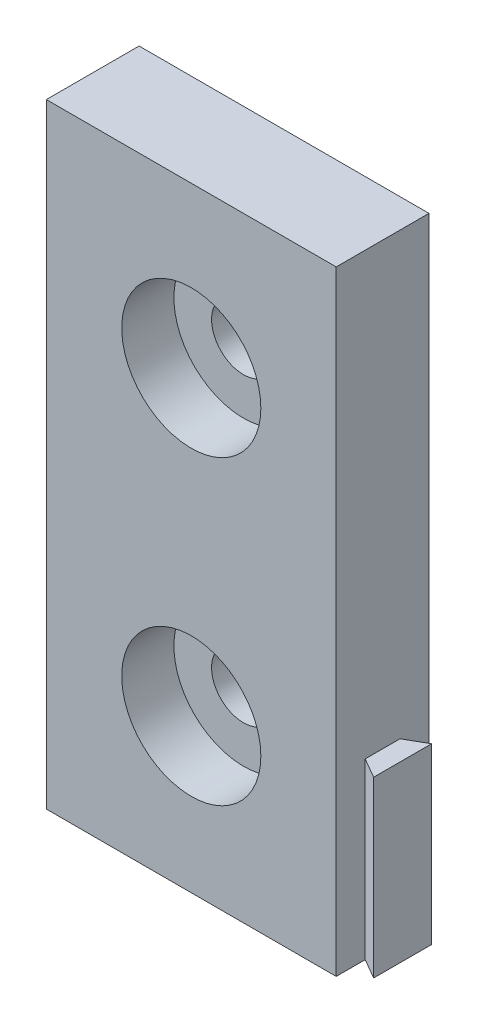
ISO-10303-21;
HEADER;
FILE_DESCRIPTION(('STEP AP214'),'2;1');
FILE_NAME('part.step','',(''),(''),'','','');
FILE_SCHEMA(('AUTOMOTIVE_DESIGN { 1 0 10303 214 1 1 1 1 }'));
ENDSEC;
DATA;
#1=APPLICATION_CONTEXT('core data for automotive mechanical design processes');
#2=APPLICATION_PROTOCOL_DEFINITION('international standard','automotive_design',2000,#1);
#3=PRODUCT_CONTEXT('',#1,'mechanical');
#4=PRODUCT('Part','Part','',(#3));
#5=PRODUCT_RELATED_PRODUCT_CATEGORY('part','',(#4));
#6=PRODUCT_DEFINITION_FORMATION('','',#4);
#7=PRODUCT_DEFINITION_CONTEXT('part definition',#1,'design');
#8=PRODUCT_DEFINITION('design','',#6,#7);
#9=PRODUCT_DEFINITION_SHAPE('','',#8);
#10=(LENGTH_UNIT() NAMED_UNIT(*) SI_UNIT(.MILLI.,.METRE.));
#11=(NAMED_UNIT(*) PLANE_ANGLE_UNIT() SI_UNIT($,.RADIAN.));
#12=(NAMED_UNIT(*) SI_UNIT($,.STERADIAN.) SOLID_ANGLE_UNIT());
#13=UNCERTAINTY_MEASURE_WITH_UNIT(LENGTH_MEASURE(1.E-05),#10,'distance_accuracy_value','');
#14=(GEOMETRIC_REPRESENTATION_CONTEXT(3) GLOBAL_UNCERTAINTY_ASSIGNED_CONTEXT((#13)) GLOBAL_UNIT_ASSIGNED_CONTEXT((#10,
#11,#12)) REPRESENTATION_CONTEXT('',''));
#15=CARTESIAN_POINT('',(0.,0.,0.));
#16=DIRECTION('',(0.,0.,1.));
#17=DIRECTION('',(1.,0.,0.));
#18=AXIS2_PLACEMENT_3D('',#15,#16,#17);
#19=CARTESIAN_POINT('',(12.5,39.2,8.));
#20=DIRECTION('',(0.,0.,-1.));
#21=DIRECTION('',(-1.,0.,0.));
#22=AXIS2_PLACEMENT_3D('',#19,#20,#21);
#23=CYLINDRICAL_SURFACE('',#22,2.75);
#24=CARTESIAN_POINT('',(12.5,39.2,0.));
#25=DIRECTION('',(0.,0.,1.));
#26=DIRECTION('',(1.,0.,0.));
#27=AXIS2_PLACEMENT_3D('',#24,#25,#26);
#28=CIRCLE('',#27,2.75);
#29=CARTESIAN_POINT('',(15.25,39.2,0.));
#30=VERTEX_POINT('',#29);
#31=EDGE_CURVE('E172',#30,#30,#28,.T.);
#32=ORIENTED_EDGE('',*,*,#31,.F.);
#33=EDGE_LOOP('',(#32));
#34=FACE_BOUND('',#33,.T.);
#35=CARTESIAN_POINT('',(12.5,39.2,3.5));
#36=DIRECTION('',(0.,0.,1.));
#37=DIRECTION('',(1.,0.,0.));
#38=AXIS2_PLACEMENT_3D('',#35,#36,#37);
#39=CIRCLE('',#38,2.75);
#40=CARTESIAN_POINT('',(15.25,39.2,3.5));
#41=VERTEX_POINT('',#40);
#42=EDGE_CURVE('E45',#41,#41,#39,.T.);
#43=ORIENTED_EDGE('',*,*,#42,.T.);
#44=EDGE_LOOP('',(#43));
#45=FACE_BOUND('',#44,.T.);
#46=ADVANCED_FACE('F41',(#34,#45),#23,.F.);
#47=CARTESIAN_POINT('',(12.5,13.2,8.));
#48=DIRECTION('',(0.,0.,-1.));
#49=DIRECTION('',(-1.,0.,0.));
#50=AXIS2_PLACEMENT_3D('',#47,#48,#49);
#51=CYLINDRICAL_SURFACE('',#50,2.75);
#52=CARTESIAN_POINT('',(12.5,13.2,0.));
#53=DIRECTION('',(0.,0.,1.));
#54=DIRECTION('',(1.,0.,0.));
#55=AXIS2_PLACEMENT_3D('',#52,#53,#54);
#56=CIRCLE('',#55,2.75);
#57=CARTESIAN_POINT('',(15.25,13.2,0.));
#58=VERTEX_POINT('',#57);
#59=EDGE_CURVE('E163',#58,#58,#56,.T.);
#60=ORIENTED_EDGE('',*,*,#59,.F.);
#61=EDGE_LOOP('',(#60));
#62=FACE_BOUND('',#61,.T.);
#63=CARTESIAN_POINT('',(12.5,13.2,3.5));
#64=DIRECTION('',(0.,0.,1.));
#65=DIRECTION('',(1.,0.,0.));
#66=AXIS2_PLACEMENT_3D('',#63,#64,#65);
#67=CIRCLE('',#66,2.75);
#68=CARTESIAN_POINT('',(15.25,13.2,3.5));
#69=VERTEX_POINT('',#68);
#70=EDGE_CURVE('E207',#69,#69,#67,.T.);
#71=ORIENTED_EDGE('',*,*,#70,.T.);
#72=EDGE_LOOP('',(#71));
#73=FACE_BOUND('',#72,.T.);
#74=ADVANCED_FACE('F264',(#62,#73),#51,.F.);
#75=CARTESIAN_POINT('',(25.,0.,8.));
#76=DIRECTION('',(-1.,0.,0.));
#77=DIRECTION('',(0.,-1.,0.));
#78=AXIS2_PLACEMENT_3D('',#75,#76,#77);
#79=PLANE('',#78);
#80=DIRECTION('',(0.,-1.,0.));
#81=VECTOR('',#80,1.);
#82=CARTESIAN_POINT('',(25.,15.,5.5));
#83=LINE('',#82,#81);
#84=CARTESIAN_POINT('',(25.,15.,5.5));
#85=VERTEX_POINT('',#84);
#86=CARTESIAN_POINT('',(25.,0.,5.5));
#87=VERTEX_POINT('',#86);
#88=EDGE_CURVE('E140',#85,#87,#83,.T.);
#89=ORIENTED_EDGE('',*,*,#88,.F.);
#90=DIRECTION('',(0.,0.,-1.));
#91=VECTOR('',#90,1.);
#92=CARTESIAN_POINT('',(25.,15.,2.5));
#93=LINE('',#92,#91);
#94=CARTESIAN_POINT('',(25.,15.,2.5));
#95=VERTEX_POINT('',#94);
#96=EDGE_CURVE('E131',#85,#95,#93,.T.);
#97=ORIENTED_EDGE('',*,*,#96,.T.);
#98=DIRECTION('',(0.,-1.,0.));
#99=VECTOR('',#98,1.);
#100=CARTESIAN_POINT('',(25.,15.,2.5));
#101=LINE('',#100,#99);
#102=CARTESIAN_POINT('',(25.,0.,2.5));
#103=VERTEX_POINT('',#102);
#104=EDGE_CURVE('E116',#95,#103,#101,.T.);
#105=ORIENTED_EDGE('',*,*,#104,.T.);
#106=DIRECTION('',(0.,0.,-1.));
#107=VECTOR('',#106,1.);
#108=CARTESIAN_POINT('',(25.,0.,8.));
#109=LINE('',#108,#107);
#110=CARTESIAN_POINT('',(25.,0.,0.));
#111=VERTEX_POINT('',#110);
#112=EDGE_CURVE('E205',#103,#111,#109,.T.);
#113=ORIENTED_EDGE('',*,*,#112,.T.);
#114=DIRECTION('',(0.,1.,0.));
#115=VECTOR('',#114,1.);
#116=CARTESIAN_POINT('',(25.,0.,0.));
#117=LINE('',#116,#115);
#118=CARTESIAN_POINT('',(25.,53.,0.));
#119=VERTEX_POINT('',#118);
#120=EDGE_CURVE('E195',#111,#119,#117,.T.);
#121=ORIENTED_EDGE('',*,*,#120,.T.);
#122=DIRECTION('',(0.,0.,-1.));
#123=VECTOR('',#122,1.);
#124=CARTESIAN_POINT('',(25.,53.,8.));
#125=LINE('',#124,#123);
#126=CARTESIAN_POINT('',(25.,53.,8.));
#127=VERTEX_POINT('',#126);
#128=EDGE_CURVE('E202',#127,#119,#125,.T.);
#129=ORIENTED_EDGE('',*,*,#128,.F.);
#130=DIRECTION('',(0.,1.,0.));
#131=VECTOR('',#130,1.);
#132=CARTESIAN_POINT('',(25.,0.,8.));
#133=LINE('',#132,#131);
#134=CARTESIAN_POINT('',(25.,0.,8.));
#135=VERTEX_POINT('',#134);
#136=EDGE_CURVE('E182',#135,#127,#133,.T.);
#137=ORIENTED_EDGE('',*,*,#136,.F.);
#138=EDGE_CURVE('E51',#135,#87,#109,.T.);
#139=ORIENTED_EDGE('',*,*,#138,.T.);
#140=EDGE_LOOP('',(#89,#97,#105,#113,#121,#129,#137,#139));
#141=FACE_BOUND('',#140,.T.);
#142=ADVANCED_FACE('F138',(#141),#79,.F.);
#143=CARTESIAN_POINT('',(0.,0.,8.));
#144=DIRECTION('',(0.,0.,-1.));
#145=DIRECTION('',(-1.,0.,0.));
#146=AXIS2_PLACEMENT_3D('',#143,#144,#145);
#147=PLANE('',#146);
#148=CARTESIAN_POINT('',(12.5,39.2,8.));
#149=DIRECTION('',(0.,0.,1.));
#150=DIRECTION('',(1.,0.,0.));
#151=AXIS2_PLACEMENT_3D('',#148,#149,#150);
#152=CIRCLE('',#151,6.);
#153=CARTESIAN_POINT('',(18.5,39.2,8.));
#154=VERTEX_POINT('',#153);
#155=EDGE_CURVE('E217',#154,#154,#152,.T.);
#156=ORIENTED_EDGE('',*,*,#155,.F.);
#157=EDGE_LOOP('',(#156));
#158=FACE_BOUND('',#157,.T.);
#159=CARTESIAN_POINT('',(12.5,13.2,8.));
#160=DIRECTION('',(0.,0.,1.));
#161=DIRECTION('',(1.,0.,0.));
#162=AXIS2_PLACEMENT_3D('',#159,#160,#161);
#163=CIRCLE('',#162,6.);
#164=CARTESIAN_POINT('',(18.5,13.2,8.));
#165=VERTEX_POINT('',#164);
#166=EDGE_CURVE('E149',#165,#165,#163,.T.);
#167=ORIENTED_EDGE('',*,*,#166,.F.);
#168=EDGE_LOOP('',(#167));
#169=FACE_BOUND('',#168,.T.);
#170=DIRECTION('',(0.,-1.,0.));
#171=VECTOR('',#170,1.);
#172=CARTESIAN_POINT('',(0.,0.,8.));
#173=LINE('',#172,#171);
#174=CARTESIAN_POINT('',(0.,53.,8.));
#175=VERTEX_POINT('',#174);
#176=CARTESIAN_POINT('',(0.,0.,8.));
#177=VERTEX_POINT('',#176);
#178=EDGE_CURVE('E177',#175,#177,#173,.T.);
#179=ORIENTED_EDGE('',*,*,#178,.T.);
#180=DIRECTION('',(1.,0.,0.));
#181=VECTOR('',#180,1.);
#182=CARTESIAN_POINT('',(0.,0.,8.));
#183=LINE('',#182,#181);
#184=EDGE_CURVE('E96',#177,#135,#183,.T.);
#185=ORIENTED_EDGE('',*,*,#184,.T.);
#186=ORIENTED_EDGE('',*,*,#136,.T.);
#187=DIRECTION('',(-1.,0.,0.));
#188=VECTOR('',#187,1.);
#189=CARTESIAN_POINT('',(0.,53.,8.));
#190=LINE('',#189,#188);
#191=EDGE_CURVE('E68',#127,#175,#190,.T.);
#192=ORIENTED_EDGE('',*,*,#191,.T.);
#193=EDGE_LOOP('',(#179,#185,#186,#192));
#194=FACE_BOUND('',#193,.T.);
#195=ADVANCED_FACE('F235',(#158,#169,#194),#147,.F.);
#196=CARTESIAN_POINT('',(0.,0.,0.));
#197=DIRECTION('',(0.,0.,-1.));
#198=DIRECTION('',(-1.,0.,0.));
#199=AXIS2_PLACEMENT_3D('',#196,#197,#198);
#200=PLANE('',#199);
#201=ORIENTED_EDGE('',*,*,#31,.T.);
#202=EDGE_LOOP('',(#201));
#203=FACE_BOUND('',#202,.T.);
#204=DIRECTION('',(0.,-1.,0.));
#205=VECTOR('',#204,1.);
#206=CARTESIAN_POINT('',(0.,0.,0.));
#207=LINE('',#206,#205);
#208=CARTESIAN_POINT('',(0.,53.,0.));
#209=VERTEX_POINT('',#208);
#210=CARTESIAN_POINT('',(0.,0.,0.));
#211=VERTEX_POINT('',#210);
#212=EDGE_CURVE('E176',#209,#211,#207,.T.);
#213=ORIENTED_EDGE('',*,*,#212,.F.);
#214=DIRECTION('',(-1.,0.,0.));
#215=VECTOR('',#214,1.);
#216=CARTESIAN_POINT('',(0.,53.,0.));
#217=LINE('',#216,#215);
#218=EDGE_CURVE('E89',#119,#209,#217,.T.);
#219=ORIENTED_EDGE('',*,*,#218,.F.);
#220=ORIENTED_EDGE('',*,*,#120,.F.);
#221=DIRECTION('',(1.,0.,0.));
#222=VECTOR('',#221,1.);
#223=CARTESIAN_POINT('',(0.,0.,0.));
#224=LINE('',#223,#222);
#225=EDGE_CURVE('E191',#211,#111,#224,.T.);
#226=ORIENTED_EDGE('',*,*,#225,.F.);
#227=EDGE_LOOP('',(#213,#219,#220,#226));
#228=FACE_BOUND('',#227,.T.);
#229=ORIENTED_EDGE('',*,*,#59,.T.);
#230=EDGE_LOOP('',(#229));
#231=FACE_BOUND('',#230,.T.);
#232=ADVANCED_FACE('F237',(#203,#228,#231),#200,.T.);
#233=CARTESIAN_POINT('',(0.,0.,8.));
#234=DIRECTION('',(1.,0.,0.));
#235=DIRECTION('',(0.,1.,0.));
#236=AXIS2_PLACEMENT_3D('',#233,#234,#235);
#237=PLANE('',#236);
#238=ORIENTED_EDGE('',*,*,#212,.T.);
#239=DIRECTION('',(0.,0.,-1.));
#240=VECTOR('',#239,1.);
#241=CARTESIAN_POINT('',(0.,0.,8.));
#242=LINE('',#241,#240);
#243=EDGE_CURVE('E11',#177,#211,#242,.T.);
#244=ORIENTED_EDGE('',*,*,#243,.F.);
#245=ORIENTED_EDGE('',*,*,#178,.F.);
#246=DIRECTION('',(0.,0.,-1.));
#247=VECTOR('',#246,1.);
#248=CARTESIAN_POINT('',(0.,53.,8.));
#249=LINE('',#248,#247);
#250=EDGE_CURVE('E187',#175,#209,#249,.T.);
#251=ORIENTED_EDGE('',*,*,#250,.T.);
#252=EDGE_LOOP('',(#238,#244,#245,#251));
#253=FACE_BOUND('',#252,.T.);
#254=ADVANCED_FACE('F43',(#253),#237,.F.);
#255=CARTESIAN_POINT('',(0.,0.,8.));
#256=DIRECTION('',(0.,1.,0.));
#257=DIRECTION('',(0.,0.,1.));
#258=AXIS2_PLACEMENT_3D('',#255,#256,#257);
#259=PLANE('',#258);
#260=ORIENTED_EDGE('',*,*,#225,.T.);
#261=ORIENTED_EDGE('',*,*,#112,.F.);
#262=DIRECTION('',(0.86602540378444,0.,-0.499999999999998));
#263=VECTOR('',#262,1.);
#264=CARTESIAN_POINT('',(25.,0.,2.5));
#265=LINE('',#264,#263);
#266=CARTESIAN_POINT('',(26.7320508075689,0.,1.5));
#267=VERTEX_POINT('',#266);
#268=EDGE_CURVE('E59',#103,#267,#265,.T.);
#269=ORIENTED_EDGE('',*,*,#268,.T.);
#270=DIRECTION('',(0.,0.,1.));
#271=VECTOR('',#270,1.);
#272=CARTESIAN_POINT('',(26.7320508075689,0.,1.5));
#273=LINE('',#272,#271);
#274=CARTESIAN_POINT('',(26.7320508075689,0.,6.5));
#275=VERTEX_POINT('',#274);
#276=EDGE_CURVE('E146',#267,#275,#273,.T.);
#277=ORIENTED_EDGE('',*,*,#276,.T.);
#278=DIRECTION('',(-0.866025403784439,0.,-0.499999999999998));
#279=VECTOR('',#278,1.);
#280=CARTESIAN_POINT('',(26.7320508075689,0.,6.5));
#281=LINE('',#280,#279);
#282=EDGE_CURVE('E142',#275,#87,#281,.T.);
#283=ORIENTED_EDGE('',*,*,#282,.T.);
#284=ORIENTED_EDGE('',*,*,#138,.F.);
#285=ORIENTED_EDGE('',*,*,#184,.F.);
#286=ORIENTED_EDGE('',*,*,#243,.T.);
#287=EDGE_LOOP('',(#260,#261,#269,#277,#283,#284,#285,#286));
#288=FACE_BOUND('',#287,.T.);
#289=ADVANCED_FACE('F244',(#288),#259,.F.);
#290=CARTESIAN_POINT('',(0.,53.,8.));
#291=DIRECTION('',(0.,-1.,0.));
#292=DIRECTION('',(0.,0.,-1.));
#293=AXIS2_PLACEMENT_3D('',#290,#291,#292);
#294=PLANE('',#293);
#295=ORIENTED_EDGE('',*,*,#218,.T.);
#296=ORIENTED_EDGE('',*,*,#250,.F.);
#297=ORIENTED_EDGE('',*,*,#191,.F.);
#298=ORIENTED_EDGE('',*,*,#128,.T.);
#299=EDGE_LOOP('',(#295,#296,#297,#298));
#300=FACE_BOUND('',#299,.T.);
#301=ADVANCED_FACE('F250',(#300),#294,.F.);
#302=CARTESIAN_POINT('',(26.7320508075689,15.,6.5));
#303=DIRECTION('',(-0.499999999999998,0.,0.866025403784439));
#304=DIRECTION('',(0.86602540378444,0.,0.499999999999999));
#305=AXIS2_PLACEMENT_3D('',#302,#303,#304);
#306=PLANE('',#305);
#307=ORIENTED_EDGE('',*,*,#282,.F.);
#308=DIRECTION('',(0.,-1.,0.));
#309=VECTOR('',#308,1.);
#310=CARTESIAN_POINT('',(26.7320508075689,15.,6.5));
#311=LINE('',#310,#309);
#312=CARTESIAN_POINT('',(26.7320508075689,15.,6.5));
#313=VERTEX_POINT('',#312);
#314=EDGE_CURVE('E164',#313,#275,#311,.T.);
#315=ORIENTED_EDGE('',*,*,#314,.F.);
#316=DIRECTION('',(-0.866025403784439,0.,-0.499999999999998));
#317=VECTOR('',#316,1.);
#318=CARTESIAN_POINT('',(26.7320508075689,15.,6.5));
#319=LINE('',#318,#317);
#320=EDGE_CURVE('E125',#313,#85,#319,.T.);
#321=ORIENTED_EDGE('',*,*,#320,.T.);
#322=ORIENTED_EDGE('',*,*,#88,.T.);
#323=EDGE_LOOP('',(#307,#315,#321,#322));
#324=FACE_BOUND('',#323,.T.);
#325=ADVANCED_FACE('F252',(#324),#306,.T.);
#326=CARTESIAN_POINT('',(26.7320508075689,15.,1.5));
#327=DIRECTION('',(1.,0.,0.));
#328=DIRECTION('',(0.,0.,-1.));
#329=AXIS2_PLACEMENT_3D('',#326,#327,#328);
#330=PLANE('',#329);
#331=ORIENTED_EDGE('',*,*,#276,.F.);
#332=DIRECTION('',(0.,-1.,0.));
#333=VECTOR('',#332,1.);
#334=CARTESIAN_POINT('',(26.7320508075689,15.,1.5));
#335=LINE('',#334,#333);
#336=CARTESIAN_POINT('',(26.7320508075689,15.,1.5));
#337=VERTEX_POINT('',#336);
#338=EDGE_CURVE('E124',#337,#267,#335,.T.);
#339=ORIENTED_EDGE('',*,*,#338,.F.);
#340=DIRECTION('',(0.,0.,1.));
#341=VECTOR('',#340,1.);
#342=CARTESIAN_POINT('',(26.7320508075689,15.,1.5));
#343=LINE('',#342,#341);
#344=EDGE_CURVE('E134',#337,#313,#343,.T.);
#345=ORIENTED_EDGE('',*,*,#344,.T.);
#346=ORIENTED_EDGE('',*,*,#314,.T.);
#347=EDGE_LOOP('',(#331,#339,#345,#346));
#348=FACE_BOUND('',#347,.T.);
#349=ADVANCED_FACE('F258',(#348),#330,.T.);
#350=CARTESIAN_POINT('',(25.,15.,2.5));
#351=DIRECTION('',(-0.499999999999998,0.,-0.86602540378444));
#352=DIRECTION('',(-0.86602540378444,0.,0.499999999999998));
#353=AXIS2_PLACEMENT_3D('',#350,#351,#352);
#354=PLANE('',#353);
#355=ORIENTED_EDGE('',*,*,#268,.F.);
#356=ORIENTED_EDGE('',*,*,#104,.F.);
#357=DIRECTION('',(0.86602540378444,0.,-0.499999999999998));
#358=VECTOR('',#357,1.);
#359=CARTESIAN_POINT('',(25.,15.,2.5));
#360=LINE('',#359,#358);
#361=EDGE_CURVE('E119',#95,#337,#360,.T.);
#362=ORIENTED_EDGE('',*,*,#361,.T.);
#363=ORIENTED_EDGE('',*,*,#338,.T.);
#364=EDGE_LOOP('',(#355,#356,#362,#363));
#365=FACE_BOUND('',#364,.T.);
#366=ADVANCED_FACE('F118',(#365),#354,.T.);
#367=CARTESIAN_POINT('',(0.,15.,0.));
#368=DIRECTION('',(0.,-1.,0.));
#369=DIRECTION('',(0.,0.,-1.));
#370=AXIS2_PLACEMENT_3D('',#367,#368,#369);
#371=PLANE('',#370);
#372=ORIENTED_EDGE('',*,*,#96,.F.);
#373=ORIENTED_EDGE('',*,*,#320,.F.);
#374=ORIENTED_EDGE('',*,*,#344,.F.);
#375=ORIENTED_EDGE('',*,*,#361,.F.);
#376=EDGE_LOOP('',(#372,#373,#374,#375));
#377=FACE_BOUND('',#376,.T.);
#378=ADVANCED_FACE('F129',(#377),#371,.F.);
#379=CARTESIAN_POINT('',(12.5,13.2,3.5));
#380=DIRECTION('',(0.,0.,1.));
#381=DIRECTION('',(1.,0.,0.));
#382=AXIS2_PLACEMENT_3D('',#379,#380,#381);
#383=CYLINDRICAL_SURFACE('',#382,6.);
#384=CARTESIAN_POINT('',(12.5,13.2,3.5));
#385=DIRECTION('',(0.,0.,1.));
#386=DIRECTION('',(1.,0.,0.));
#387=AXIS2_PLACEMENT_3D('',#384,#385,#386);
#388=CIRCLE('',#387,6.);
#389=CARTESIAN_POINT('',(18.5,13.2,3.5));
#390=VERTEX_POINT('',#389);
#391=EDGE_CURVE('E223',#390,#390,#388,.T.);
#392=ORIENTED_EDGE('',*,*,#391,.F.);
#393=EDGE_LOOP('',(#392));
#394=FACE_BOUND('',#393,.T.);
#395=ORIENTED_EDGE('',*,*,#166,.T.);
#396=EDGE_LOOP('',(#395));
#397=FACE_BOUND('',#396,.T.);
#398=ADVANCED_FACE('F233',(#394,#397),#383,.F.);
#399=CARTESIAN_POINT('',(12.5,13.2,3.5));
#400=DIRECTION('',(0.,0.,1.));
#401=DIRECTION('',(1.,0.,0.));
#402=AXIS2_PLACEMENT_3D('',#399,#400,#401);
#403=PLANE('',#402);
#404=ORIENTED_EDGE('',*,*,#70,.F.);
#405=EDGE_LOOP('',(#404));
#406=FACE_BOUND('',#405,.T.);
#407=ORIENTED_EDGE('',*,*,#391,.T.);
#408=EDGE_LOOP('',(#407));
#409=FACE_BOUND('',#408,.T.);
#410=ADVANCED_FACE('F347',(#406,#409),#403,.T.);
#411=CARTESIAN_POINT('',(12.5,39.2,3.5));
#412=DIRECTION('',(0.,0.,1.));
#413=DIRECTION('',(1.,0.,0.));
#414=AXIS2_PLACEMENT_3D('',#411,#412,#413);
#415=CYLINDRICAL_SURFACE('',#414,6.);
#416=CARTESIAN_POINT('',(12.5,39.2,3.5));
#417=DIRECTION('',(0.,0.,1.));
#418=DIRECTION('',(1.,0.,0.));
#419=AXIS2_PLACEMENT_3D('',#416,#417,#418);
#420=CIRCLE('',#419,6.);
#421=CARTESIAN_POINT('',(18.5,39.2,3.5));
#422=VERTEX_POINT('',#421);
#423=EDGE_CURVE('E210',#422,#422,#420,.T.);
#424=ORIENTED_EDGE('',*,*,#423,.F.);
#425=EDGE_LOOP('',(#424));
#426=FACE_BOUND('',#425,.T.);
#427=ORIENTED_EDGE('',*,*,#155,.T.);
#428=EDGE_LOOP('',(#427));
#429=FACE_BOUND('',#428,.T.);
#430=ADVANCED_FACE('F357',(#426,#429),#415,.F.);
#431=CARTESIAN_POINT('',(12.5,39.2,3.5));
#432=DIRECTION('',(0.,0.,1.));
#433=DIRECTION('',(1.,0.,0.));
#434=AXIS2_PLACEMENT_3D('',#431,#432,#433);
#435=PLANE('',#434);
#436=ORIENTED_EDGE('',*,*,#42,.F.);
#437=EDGE_LOOP('',(#436));
#438=FACE_BOUND('',#437,.T.);
#439=ORIENTED_EDGE('',*,*,#423,.T.);
#440=EDGE_LOOP('',(#439));
#441=FACE_BOUND('',#440,.T.);
#442=ADVANCED_FACE('F367',(#438,#441),#435,.T.);
#443=CLOSED_SHELL('',(#46,#74,#142,#195,#232,#254,#289,#301,#325,#349,#366,#378,#398,#410,#430,#442));
#444=MANIFOLD_SOLID_BREP('B2',#443);
#445=ADVANCED_BREP_SHAPE_REPRESENTATION('',(#18,#444),#14);
#446=SHAPE_DEFINITION_REPRESENTATION(#9,#445);
ENDSEC;
END-ISO-10303-21;
